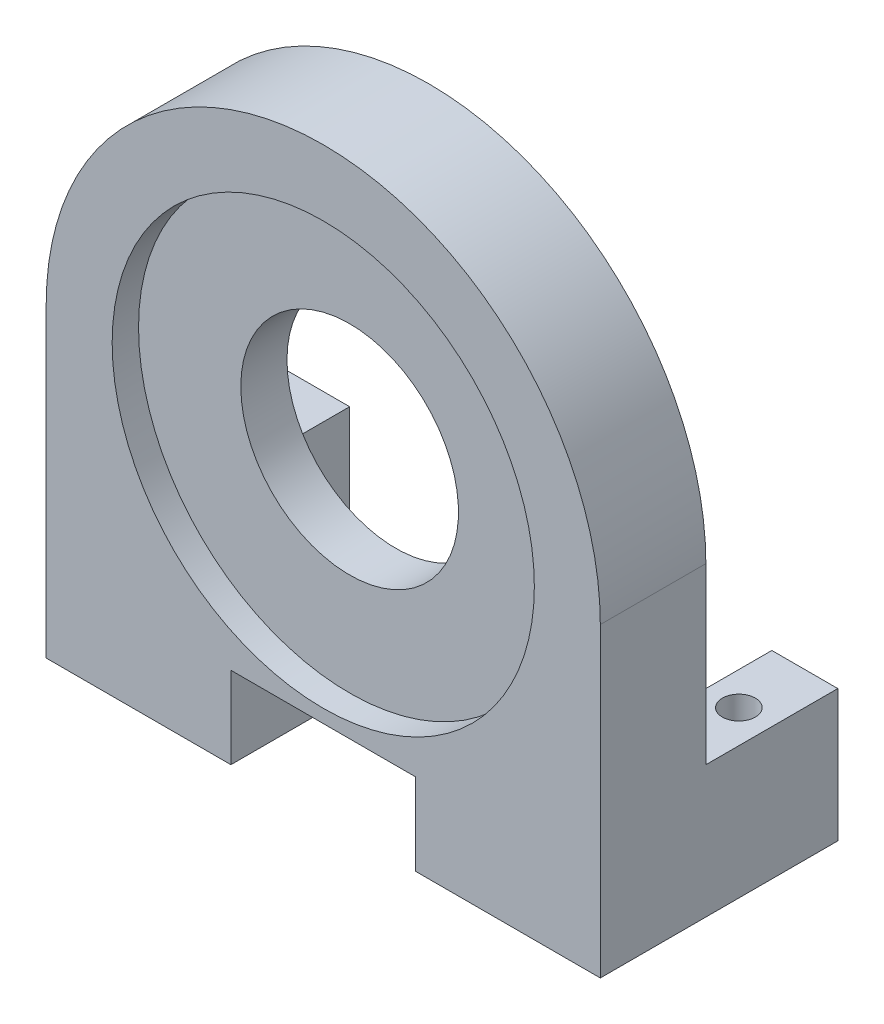
ISO-10303-21;
HEADER;
FILE_DESCRIPTION(('STEP AP214'),'2;1');
FILE_NAME('part.step','',(''),(''),'','','');
FILE_SCHEMA(('AUTOMOTIVE_DESIGN { 1 0 10303 214 1 1 1 1 }'));
ENDSEC;
DATA;
#1=APPLICATION_CONTEXT('core data for automotive mechanical design processes');
#2=APPLICATION_PROTOCOL_DEFINITION('international standard','automotive_design',2000,#1);
#3=PRODUCT_CONTEXT('',#1,'mechanical');
#4=PRODUCT('Part','Part','',(#3));
#5=PRODUCT_RELATED_PRODUCT_CATEGORY('part','',(#4));
#6=PRODUCT_DEFINITION_FORMATION('','',#4);
#7=PRODUCT_DEFINITION_CONTEXT('part definition',#1,'design');
#8=PRODUCT_DEFINITION('design','',#6,#7);
#9=PRODUCT_DEFINITION_SHAPE('','',#8);
#10=(LENGTH_UNIT() NAMED_UNIT(*) SI_UNIT(.MILLI.,.METRE.));
#11=(NAMED_UNIT(*) PLANE_ANGLE_UNIT() SI_UNIT($,.RADIAN.));
#12=(NAMED_UNIT(*) SI_UNIT($,.STERADIAN.) SOLID_ANGLE_UNIT());
#13=UNCERTAINTY_MEASURE_WITH_UNIT(LENGTH_MEASURE(1.E-05),#10,'distance_accuracy_value','');
#14=(GEOMETRIC_REPRESENTATION_CONTEXT(3) GLOBAL_UNCERTAINTY_ASSIGNED_CONTEXT((#13)) GLOBAL_UNIT_ASSIGNED_CONTEXT((#10,
#11,#12)) REPRESENTATION_CONTEXT('',''));
#15=CARTESIAN_POINT('',(0.,0.,0.));
#16=DIRECTION('',(0.,0.,1.));
#17=DIRECTION('',(1.,0.,0.));
#18=AXIS2_PLACEMENT_3D('',#15,#16,#17);
#19=CARTESIAN_POINT('',(-21.,0.,4.));
#20=DIRECTION('',(0.,1.,0.));
#21=DIRECTION('',(-1.,0.,0.));
#22=AXIS2_PLACEMENT_3D('',#19,#20,#21);
#23=PLANE('',#22);
#24=CARTESIAN_POINT('',(18.5,0.,-0.999999999999995));
#25=DIRECTION('',(0.,-1.,0.));
#26=DIRECTION('',(0.,0.,1.));
#27=AXIS2_PLACEMENT_3D('',#24,#25,#26);
#28=CIRCLE('',#27,1.25);
#29=CARTESIAN_POINT('',(18.5,0.,0.250000000000006));
#30=VERTEX_POINT('',#29);
#31=EDGE_CURVE('E167',#30,#30,#28,.T.);
#32=ORIENTED_EDGE('',*,*,#31,.F.);
#33=EDGE_LOOP('',(#32));
#34=FACE_BOUND('',#33,.T.);
#35=CARTESIAN_POINT('',(18.5,0.,-9.));
#36=DIRECTION('',(0.,-1.,0.));
#37=DIRECTION('',(0.,0.,1.));
#38=AXIS2_PLACEMENT_3D('',#35,#36,#37);
#39=CIRCLE('',#38,1.25);
#40=CARTESIAN_POINT('',(18.5,0.,-7.74999999999999));
#41=VERTEX_POINT('',#40);
#42=EDGE_CURVE('E175',#41,#41,#39,.T.);
#43=ORIENTED_EDGE('',*,*,#42,.F.);
#44=EDGE_LOOP('',(#43));
#45=FACE_BOUND('',#44,.T.);
#46=DIRECTION('',(1.,0.,0.));
#47=VECTOR('',#46,1.);
#48=CARTESIAN_POINT('',(-21.,0.,4.));
#49=LINE('',#48,#47);
#50=CARTESIAN_POINT('',(7.,0.,4.));
#51=VERTEX_POINT('',#50);
#52=CARTESIAN_POINT('',(21.,0.,4.));
#53=VERTEX_POINT('',#52);
#54=EDGE_CURVE('E256',#51,#53,#49,.T.);
#55=ORIENTED_EDGE('',*,*,#54,.F.);
#56=DIRECTION('',(0.,0.,-1.));
#57=VECTOR('',#56,1.);
#58=CARTESIAN_POINT('',(7.,0.,4.));
#59=LINE('',#58,#57);
#60=CARTESIAN_POINT('',(7.,0.,-4.));
#61=VERTEX_POINT('',#60);
#62=EDGE_CURVE('E12',#51,#61,#59,.T.);
#63=ORIENTED_EDGE('',*,*,#62,.T.);
#64=DIRECTION('',(1.,0.,0.));
#65=VECTOR('',#64,1.);
#66=CARTESIAN_POINT('',(-21.,0.,-4.));
#67=LINE('',#66,#65);
#68=CARTESIAN_POINT('',(16.,0.,-4.));
#69=VERTEX_POINT('',#68);
#70=EDGE_CURVE('E266',#61,#69,#67,.T.);
#71=ORIENTED_EDGE('',*,*,#70,.T.);
#72=DIRECTION('',(0.,0.,1.));
#73=VECTOR('',#72,1.);
#74=CARTESIAN_POINT('',(16.,0.,-14.));
#75=LINE('',#74,#73);
#76=CARTESIAN_POINT('',(16.,0.,-14.));
#77=VERTEX_POINT('',#76);
#78=EDGE_CURVE('E232',#77,#69,#75,.T.);
#79=ORIENTED_EDGE('',*,*,#78,.F.);
#80=DIRECTION('',(-1.,0.,0.));
#81=VECTOR('',#80,1.);
#82=CARTESIAN_POINT('',(21.,0.,-14.));
#83=LINE('',#82,#81);
#84=CARTESIAN_POINT('',(21.,0.,-14.));
#85=VERTEX_POINT('',#84);
#86=EDGE_CURVE('E215',#85,#77,#83,.T.);
#87=ORIENTED_EDGE('',*,*,#86,.F.);
#88=DIRECTION('',(0.,0.,-1.));
#89=VECTOR('',#88,1.);
#90=CARTESIAN_POINT('',(21.,0.,4.));
#91=LINE('',#90,#89);
#92=EDGE_CURVE('E277',#53,#85,#91,.T.);
#93=ORIENTED_EDGE('',*,*,#92,.F.);
#94=EDGE_LOOP('',(#55,#63,#71,#79,#87,#93));
#95=FACE_BOUND('',#94,.T.);
#96=ADVANCED_FACE('F35',(#34,#45,#95),#23,.F.);
#97=CARTESIAN_POINT('',(0.,23.2,-4.));
#98=DIRECTION('',(0.,0.,-1.));
#99=DIRECTION('',(-1.,0.,0.));
#100=AXIS2_PLACEMENT_3D('',#97,#98,#99);
#101=PLANE('',#100);
#102=DIRECTION('',(0.,-1.,0.));
#103=VECTOR('',#102,1.);
#104=CARTESIAN_POINT('',(7.,-6.20000000000002,-4.));
#105=LINE('',#104,#103);
#106=CARTESIAN_POINT('',(7.,6.20000000000002,-4.));
#107=VERTEX_POINT('',#106);
#108=EDGE_CURVE('E159',#107,#61,#105,.T.);
#109=ORIENTED_EDGE('',*,*,#108,.F.);
#110=DIRECTION('',(1.,0.,0.));
#111=VECTOR('',#110,1.);
#112=CARTESIAN_POINT('',(7.,6.20000000000002,-4.));
#113=LINE('',#112,#111);
#114=CARTESIAN_POINT('',(-7.,6.20000000000002,-4.));
#115=VERTEX_POINT('',#114);
#116=EDGE_CURVE('E161',#115,#107,#113,.T.);
#117=ORIENTED_EDGE('',*,*,#116,.F.);
#118=DIRECTION('',(0.,1.,0.));
#119=VECTOR('',#118,1.);
#120=CARTESIAN_POINT('',(-7.,-6.20000000000002,-4.));
#121=LINE('',#120,#119);
#122=CARTESIAN_POINT('',(-7.,0.,-4.));
#123=VERTEX_POINT('',#122);
#124=EDGE_CURVE('E140',#123,#115,#121,.T.);
#125=ORIENTED_EDGE('',*,*,#124,.F.);
#126=CARTESIAN_POINT('',(-16.,0.,-4.));
#127=VERTEX_POINT('',#126);
#128=EDGE_CURVE('E267',#127,#123,#67,.T.);
#129=ORIENTED_EDGE('',*,*,#128,.F.);
#130=DIRECTION('',(0.,-1.,0.));
#131=VECTOR('',#130,1.);
#132=CARTESIAN_POINT('',(-16.,0.,-4.));
#133=LINE('',#132,#131);
#134=CARTESIAN_POINT('',(-16.,10.,-4.));
#135=VERTEX_POINT('',#134);
#136=EDGE_CURVE('E197',#135,#127,#133,.T.);
#137=ORIENTED_EDGE('',*,*,#136,.F.);
#138=DIRECTION('',(1.,0.,0.));
#139=VECTOR('',#138,1.);
#140=CARTESIAN_POINT('',(-21.,10.,-4.));
#141=LINE('',#140,#139);
#142=CARTESIAN_POINT('',(-21.,10.,-4.));
#143=VERTEX_POINT('',#142);
#144=EDGE_CURVE('E192',#143,#135,#141,.T.);
#145=ORIENTED_EDGE('',*,*,#144,.F.);
#146=DIRECTION('',(0.,-1.,0.));
#147=VECTOR('',#146,1.);
#148=CARTESIAN_POINT('',(-21.,0.,-4.));
#149=LINE('',#148,#147);
#150=CARTESIAN_POINT('',(-21.,23.2,-4.));
#151=VERTEX_POINT('',#150);
#152=EDGE_CURVE('E251',#151,#143,#149,.T.);
#153=ORIENTED_EDGE('',*,*,#152,.F.);
#154=CARTESIAN_POINT('',(0.,23.2,-4.));
#155=DIRECTION('',(0.,0.,1.));
#156=DIRECTION('',(-1.,0.,0.));
#157=AXIS2_PLACEMENT_3D('',#154,#155,#156);
#158=CIRCLE('',#157,21.);
#159=CARTESIAN_POINT('',(21.,23.2,-4.));
#160=VERTEX_POINT('',#159);
#161=EDGE_CURVE('E257',#160,#151,#158,.T.);
#162=ORIENTED_EDGE('',*,*,#161,.F.);
#163=DIRECTION('',(0.,1.,0.));
#164=VECTOR('',#163,1.);
#165=CARTESIAN_POINT('',(21.,23.2,-4.));
#166=LINE('',#165,#164);
#167=CARTESIAN_POINT('',(21.,10.,-4.));
#168=VERTEX_POINT('',#167);
#169=EDGE_CURVE('E269',#168,#160,#166,.T.);
#170=ORIENTED_EDGE('',*,*,#169,.F.);
#171=DIRECTION('',(1.,0.,0.));
#172=VECTOR('',#171,1.);
#173=CARTESIAN_POINT('',(21.,10.,-4.));
#174=LINE('',#173,#172);
#175=CARTESIAN_POINT('',(16.,10.,-4.));
#176=VERTEX_POINT('',#175);
#177=EDGE_CURVE('E216',#176,#168,#174,.T.);
#178=ORIENTED_EDGE('',*,*,#177,.F.);
#179=DIRECTION('',(0.,1.,0.));
#180=VECTOR('',#179,1.);
#181=CARTESIAN_POINT('',(16.,0.,-4.));
#182=LINE('',#181,#180);
#183=EDGE_CURVE('E211',#69,#176,#182,.T.);
#184=ORIENTED_EDGE('',*,*,#183,.F.);
#185=ORIENTED_EDGE('',*,*,#70,.F.);
#186=EDGE_LOOP('',(#109,#117,#125,#129,#137,#145,#153,#162,#170,#178,#184,#185));
#187=FACE_BOUND('',#186,.T.);
#188=CARTESIAN_POINT('',(0.,23.2,-4.));
#189=DIRECTION('',(0.,0.,1.));
#190=DIRECTION('',(1.,0.,0.));
#191=AXIS2_PLACEMENT_3D('',#188,#189,#190);
#192=CIRCLE('',#191,16.);
#193=CARTESIAN_POINT('',(16.,23.2,-4.));
#194=VERTEX_POINT('',#193);
#195=EDGE_CURVE('E247',#194,#194,#192,.T.);
#196=ORIENTED_EDGE('',*,*,#195,.T.);
#197=EDGE_LOOP('',(#196));
#198=FACE_BOUND('',#197,.T.);
#199=ADVANCED_FACE('F284',(#187,#198),#101,.T.);
#200=CARTESIAN_POINT('',(0.,23.2,4.));
#201=DIRECTION('',(0.,0.,-1.));
#202=DIRECTION('',(-1.,0.,0.));
#203=AXIS2_PLACEMENT_3D('',#200,#201,#202);
#204=CYLINDRICAL_SURFACE('',#203,16.);
#205=CARTESIAN_POINT('',(0.,23.2,4.));
#206=DIRECTION('',(0.,0.,1.));
#207=DIRECTION('',(1.,0.,0.));
#208=AXIS2_PLACEMENT_3D('',#205,#206,#207);
#209=CIRCLE('',#208,16.);
#210=CARTESIAN_POINT('',(16.,23.2,4.));
#211=VERTEX_POINT('',#210);
#212=EDGE_CURVE('E248',#211,#211,#209,.T.);
#213=ORIENTED_EDGE('',*,*,#212,.T.);
#214=EDGE_LOOP('',(#213));
#215=FACE_BOUND('',#214,.T.);
#216=CARTESIAN_POINT('',(0.,23.2,2.));
#217=DIRECTION('',(0.,0.,-1.));
#218=DIRECTION('',(-1.,0.,0.));
#219=AXIS2_PLACEMENT_3D('',#216,#217,#218);
#220=CIRCLE('',#219,16.);
#221=CARTESIAN_POINT('',(-16.,23.2,2.));
#222=VERTEX_POINT('',#221);
#223=EDGE_CURVE('E241',#222,#222,#220,.T.);
#224=ORIENTED_EDGE('',*,*,#223,.T.);
#225=EDGE_LOOP('',(#224));
#226=FACE_BOUND('',#225,.T.);
#227=ADVANCED_FACE('F339',(#215,#226),#204,.F.);
#228=ORIENTED_EDGE('',*,*,#195,.F.);
#229=EDGE_LOOP('',(#228));
#230=FACE_BOUND('',#229,.T.);
#231=CARTESIAN_POINT('',(0.,23.2,-1.5));
#232=DIRECTION('',(0.,0.,1.));
#233=DIRECTION('',(1.,0.,0.));
#234=AXIS2_PLACEMENT_3D('',#231,#232,#233);
#235=CIRCLE('',#234,16.);
#236=CARTESIAN_POINT('',(16.,23.2,-1.5));
#237=VERTEX_POINT('',#236);
#238=EDGE_CURVE('E238',#237,#237,#235,.T.);
#239=ORIENTED_EDGE('',*,*,#238,.T.);
#240=EDGE_LOOP('',(#239));
#241=FACE_BOUND('',#240,.T.);
#242=ADVANCED_FACE('F432',(#230,#241),#204,.F.);
#243=CARTESIAN_POINT('',(0.,23.2,4.));
#244=DIRECTION('',(0.,0.,-1.));
#245=DIRECTION('',(-1.,0.,0.));
#246=AXIS2_PLACEMENT_3D('',#243,#244,#245);
#247=PLANE('',#246);
#248=DIRECTION('',(1.,0.,0.));
#249=VECTOR('',#248,1.);
#250=CARTESIAN_POINT('',(7.,6.20000000000002,4.));
#251=LINE('',#250,#249);
#252=CARTESIAN_POINT('',(-7.,6.20000000000002,4.));
#253=VERTEX_POINT('',#252);
#254=CARTESIAN_POINT('',(7.,6.20000000000002,4.));
#255=VERTEX_POINT('',#254);
#256=EDGE_CURVE('E148',#253,#255,#251,.T.);
#257=ORIENTED_EDGE('',*,*,#256,.T.);
#258=DIRECTION('',(0.,-1.,0.));
#259=VECTOR('',#258,1.);
#260=CARTESIAN_POINT('',(7.,-6.20000000000002,4.));
#261=LINE('',#260,#259);
#262=EDGE_CURVE('E145',#255,#51,#261,.T.);
#263=ORIENTED_EDGE('',*,*,#262,.T.);
#264=ORIENTED_EDGE('',*,*,#54,.T.);
#265=DIRECTION('',(0.,1.,0.));
#266=VECTOR('',#265,1.);
#267=CARTESIAN_POINT('',(21.,23.2,4.));
#268=LINE('',#267,#266);
#269=CARTESIAN_POINT('',(21.,23.2,4.));
#270=VERTEX_POINT('',#269);
#271=EDGE_CURVE('E259',#53,#270,#268,.T.);
#272=ORIENTED_EDGE('',*,*,#271,.T.);
#273=CARTESIAN_POINT('',(0.,23.2,4.));
#274=DIRECTION('',(0.,0.,1.));
#275=DIRECTION('',(-1.,0.,0.));
#276=AXIS2_PLACEMENT_3D('',#273,#274,#275);
#277=CIRCLE('',#276,21.);
#278=CARTESIAN_POINT('',(-21.,23.2,4.));
#279=VERTEX_POINT('',#278);
#280=EDGE_CURVE('E261',#270,#279,#277,.T.);
#281=ORIENTED_EDGE('',*,*,#280,.T.);
#282=DIRECTION('',(0.,-1.,0.));
#283=VECTOR('',#282,1.);
#284=CARTESIAN_POINT('',(-21.,0.,4.));
#285=LINE('',#284,#283);
#286=CARTESIAN_POINT('',(-21.,0.,4.));
#287=VERTEX_POINT('',#286);
#288=EDGE_CURVE('E254',#279,#287,#285,.T.);
#289=ORIENTED_EDGE('',*,*,#288,.T.);
#290=CARTESIAN_POINT('',(-7.,0.,4.));
#291=VERTEX_POINT('',#290);
#292=EDGE_CURVE('E158',#287,#291,#49,.T.);
#293=ORIENTED_EDGE('',*,*,#292,.T.);
#294=DIRECTION('',(0.,1.,0.));
#295=VECTOR('',#294,1.);
#296=CARTESIAN_POINT('',(-7.,-6.20000000000002,4.));
#297=LINE('',#296,#295);
#298=EDGE_CURVE('E50',#291,#253,#297,.T.);
#299=ORIENTED_EDGE('',*,*,#298,.T.);
#300=EDGE_LOOP('',(#257,#263,#264,#272,#281,#289,#293,#299));
#301=FACE_BOUND('',#300,.T.);
#302=ORIENTED_EDGE('',*,*,#212,.F.);
#303=EDGE_LOOP('',(#302));
#304=FACE_BOUND('',#303,.T.);
#305=ADVANCED_FACE('F155',(#301,#304),#247,.F.);
#306=CARTESIAN_POINT('',(-21.,0.,4.));
#307=DIRECTION('',(1.,0.,0.));
#308=DIRECTION('',(0.,0.,-1.));
#309=AXIS2_PLACEMENT_3D('',#306,#307,#308);
#310=PLANE('',#309);
#311=ORIENTED_EDGE('',*,*,#152,.T.);
#312=DIRECTION('',(0.,0.,1.));
#313=VECTOR('',#312,1.);
#314=CARTESIAN_POINT('',(-21.,10.,-14.));
#315=LINE('',#314,#313);
#316=CARTESIAN_POINT('',(-21.,10.,-14.));
#317=VERTEX_POINT('',#316);
#318=EDGE_CURVE('E209',#317,#143,#315,.T.);
#319=ORIENTED_EDGE('',*,*,#318,.F.);
#320=DIRECTION('',(0.,1.,0.));
#321=VECTOR('',#320,1.);
#322=CARTESIAN_POINT('',(-21.,0.,-14.));
#323=LINE('',#322,#321);
#324=CARTESIAN_POINT('',(-21.,0.,-14.));
#325=VERTEX_POINT('',#324);
#326=EDGE_CURVE('E196',#325,#317,#323,.T.);
#327=ORIENTED_EDGE('',*,*,#326,.F.);
#328=DIRECTION('',(0.,0.,-1.));
#329=VECTOR('',#328,1.);
#330=CARTESIAN_POINT('',(-21.,0.,4.));
#331=LINE('',#330,#329);
#332=EDGE_CURVE('E279',#287,#325,#331,.T.);
#333=ORIENTED_EDGE('',*,*,#332,.F.);
#334=ORIENTED_EDGE('',*,*,#288,.F.);
#335=DIRECTION('',(0.,0.,-1.));
#336=VECTOR('',#335,1.);
#337=CARTESIAN_POINT('',(-21.,23.2,4.));
#338=LINE('',#337,#336);
#339=EDGE_CURVE('E263',#279,#151,#338,.T.);
#340=ORIENTED_EDGE('',*,*,#339,.T.);
#341=EDGE_LOOP('',(#311,#319,#327,#333,#334,#340));
#342=FACE_BOUND('',#341,.T.);
#343=ADVANCED_FACE('F37',(#342),#310,.F.);
#344=CARTESIAN_POINT('',(-18.5,0.,-1.));
#345=DIRECTION('',(0.,-1.,0.));
#346=DIRECTION('',(0.,0.,-1.));
#347=AXIS2_PLACEMENT_3D('',#344,#345,#346);
#348=CIRCLE('',#347,1.25);
#349=CARTESIAN_POINT('',(-18.5,0.,-2.25));
#350=VERTEX_POINT('',#349);
#351=EDGE_CURVE('E174',#350,#350,#348,.T.);
#352=ORIENTED_EDGE('',*,*,#351,.F.);
#353=EDGE_LOOP('',(#352));
#354=FACE_BOUND('',#353,.T.);
#355=CARTESIAN_POINT('',(-18.5,0.,-9.));
#356=DIRECTION('',(0.,-1.,0.));
#357=DIRECTION('',(0.,0.,-1.));
#358=AXIS2_PLACEMENT_3D('',#355,#356,#357);
#359=CIRCLE('',#358,1.25);
#360=CARTESIAN_POINT('',(-18.5,0.,-10.25));
#361=VERTEX_POINT('',#360);
#362=EDGE_CURVE('E182',#361,#361,#359,.T.);
#363=ORIENTED_EDGE('',*,*,#362,.F.);
#364=EDGE_LOOP('',(#363));
#365=FACE_BOUND('',#364,.T.);
#366=ORIENTED_EDGE('',*,*,#128,.T.);
#367=DIRECTION('',(0.,0.,1.));
#368=VECTOR('',#367,1.);
#369=CARTESIAN_POINT('',(-7.,0.,4.));
#370=LINE('',#369,#368);
#371=EDGE_CURVE('E43',#123,#291,#370,.T.);
#372=ORIENTED_EDGE('',*,*,#371,.T.);
#373=ORIENTED_EDGE('',*,*,#292,.F.);
#374=ORIENTED_EDGE('',*,*,#332,.T.);
#375=DIRECTION('',(-1.,0.,0.));
#376=VECTOR('',#375,1.);
#377=CARTESIAN_POINT('',(-21.,0.,-14.));
#378=LINE('',#377,#376);
#379=CARTESIAN_POINT('',(-16.,0.,-14.));
#380=VERTEX_POINT('',#379);
#381=EDGE_CURVE('E193',#380,#325,#378,.T.);
#382=ORIENTED_EDGE('',*,*,#381,.F.);
#383=DIRECTION('',(0.,0.,1.));
#384=VECTOR('',#383,1.);
#385=CARTESIAN_POINT('',(-16.,0.,-14.));
#386=LINE('',#385,#384);
#387=EDGE_CURVE('E58',#380,#127,#386,.T.);
#388=ORIENTED_EDGE('',*,*,#387,.T.);
#389=EDGE_LOOP('',(#366,#372,#373,#374,#382,#388));
#390=FACE_BOUND('',#389,.T.);
#391=ADVANCED_FACE('F280',(#354,#365,#390),#23,.F.);
#392=CARTESIAN_POINT('',(21.,23.2,4.));
#393=DIRECTION('',(-1.,0.,0.));
#394=DIRECTION('',(0.,0.,1.));
#395=AXIS2_PLACEMENT_3D('',#392,#393,#394);
#396=PLANE('',#395);
#397=ORIENTED_EDGE('',*,*,#92,.T.);
#398=DIRECTION('',(0.,-1.,0.));
#399=VECTOR('',#398,1.);
#400=CARTESIAN_POINT('',(21.,0.,-14.));
#401=LINE('',#400,#399);
#402=CARTESIAN_POINT('',(21.,10.,-14.));
#403=VERTEX_POINT('',#402);
#404=EDGE_CURVE('E212',#403,#85,#401,.T.);
#405=ORIENTED_EDGE('',*,*,#404,.F.);
#406=DIRECTION('',(0.,0.,1.));
#407=VECTOR('',#406,1.);
#408=CARTESIAN_POINT('',(21.,10.,-14.));
#409=LINE('',#408,#407);
#410=EDGE_CURVE('E222',#403,#168,#409,.T.);
#411=ORIENTED_EDGE('',*,*,#410,.T.);
#412=ORIENTED_EDGE('',*,*,#169,.T.);
#413=DIRECTION('',(0.,0.,-1.));
#414=VECTOR('',#413,1.);
#415=CARTESIAN_POINT('',(21.,23.2,4.));
#416=LINE('',#415,#414);
#417=EDGE_CURVE('E274',#270,#160,#416,.T.);
#418=ORIENTED_EDGE('',*,*,#417,.F.);
#419=ORIENTED_EDGE('',*,*,#271,.F.);
#420=EDGE_LOOP('',(#397,#405,#411,#412,#418,#419));
#421=FACE_BOUND('',#420,.T.);
#422=ADVANCED_FACE('F301',(#421),#396,.F.);
#423=CARTESIAN_POINT('',(0.,23.2,4.));
#424=DIRECTION('',(0.,0.,-1.));
#425=DIRECTION('',(-1.,0.,0.));
#426=AXIS2_PLACEMENT_3D('',#423,#424,#425);
#427=CYLINDRICAL_SURFACE('',#426,21.);
#428=ORIENTED_EDGE('',*,*,#161,.T.);
#429=ORIENTED_EDGE('',*,*,#339,.F.);
#430=ORIENTED_EDGE('',*,*,#280,.F.);
#431=ORIENTED_EDGE('',*,*,#417,.T.);
#432=EDGE_LOOP('',(#428,#429,#430,#431));
#433=FACE_BOUND('',#432,.T.);
#434=ADVANCED_FACE('F304',(#433),#427,.T.);
#435=CARTESIAN_POINT('',(0.,23.2,49.254833995939));
#436=DIRECTION('',(0.,0.,-1.));
#437=DIRECTION('',(-1.,0.,0.));
#438=AXIS2_PLACEMENT_3D('',#435,#436,#437);
#439=CYLINDRICAL_SURFACE('',#438,8.25);
#440=CARTESIAN_POINT('',(0.,23.2,2.));
#441=DIRECTION('',(0.,0.,-1.));
#442=DIRECTION('',(-1.,0.,0.));
#443=AXIS2_PLACEMENT_3D('',#440,#441,#442);
#444=CIRCLE('',#443,8.25);
#445=CARTESIAN_POINT('',(-8.25000000000002,23.2,2.));
#446=VERTEX_POINT('',#445);
#447=EDGE_CURVE('E244',#446,#446,#444,.T.);
#448=ORIENTED_EDGE('',*,*,#447,.F.);
#449=EDGE_LOOP('',(#448));
#450=FACE_BOUND('',#449,.T.);
#451=CARTESIAN_POINT('',(0.,23.2,-1.5));
#452=DIRECTION('',(0.,0.,1.));
#453=DIRECTION('',(1.,0.,0.));
#454=AXIS2_PLACEMENT_3D('',#451,#452,#453);
#455=CIRCLE('',#454,8.25);
#456=CARTESIAN_POINT('',(8.24999999999998,23.2,-1.5));
#457=VERTEX_POINT('',#456);
#458=EDGE_CURVE('E235',#457,#457,#455,.T.);
#459=ORIENTED_EDGE('',*,*,#458,.F.);
#460=EDGE_LOOP('',(#459));
#461=FACE_BOUND('',#460,.T.);
#462=ADVANCED_FACE('F541',(#450,#461),#439,.F.);
#463=CARTESIAN_POINT('',(0.,23.2,2.));
#464=DIRECTION('',(0.,0.,-1.));
#465=DIRECTION('',(-1.,0.,0.));
#466=AXIS2_PLACEMENT_3D('',#463,#464,#465);
#467=PLANE('',#466);
#468=ORIENTED_EDGE('',*,*,#447,.T.);
#469=EDGE_LOOP('',(#468));
#470=FACE_BOUND('',#469,.T.);
#471=ORIENTED_EDGE('',*,*,#223,.F.);
#472=EDGE_LOOP('',(#471));
#473=FACE_BOUND('',#472,.T.);
#474=ADVANCED_FACE('F534',(#470,#473),#467,.F.);
#475=CARTESIAN_POINT('',(0.,23.2,-1.5));
#476=DIRECTION('',(0.,0.,1.));
#477=DIRECTION('',(1.,0.,0.));
#478=AXIS2_PLACEMENT_3D('',#475,#476,#477);
#479=PLANE('',#478);
#480=ORIENTED_EDGE('',*,*,#458,.T.);
#481=EDGE_LOOP('',(#480));
#482=FACE_BOUND('',#481,.T.);
#483=ORIENTED_EDGE('',*,*,#238,.F.);
#484=EDGE_LOOP('',(#483));
#485=FACE_BOUND('',#484,.T.);
#486=ADVANCED_FACE('F464',(#482,#485),#479,.F.);
#487=CARTESIAN_POINT('',(16.,0.,-14.));
#488=DIRECTION('',(1.,0.,0.));
#489=DIRECTION('',(0.,0.,-1.));
#490=AXIS2_PLACEMENT_3D('',#487,#488,#489);
#491=PLANE('',#490);
#492=ORIENTED_EDGE('',*,*,#183,.T.);
#493=DIRECTION('',(0.,0.,1.));
#494=VECTOR('',#493,1.);
#495=CARTESIAN_POINT('',(16.,10.,-14.));
#496=LINE('',#495,#494);
#497=CARTESIAN_POINT('',(16.,10.,-14.));
#498=VERTEX_POINT('',#497);
#499=EDGE_CURVE('E229',#498,#176,#496,.T.);
#500=ORIENTED_EDGE('',*,*,#499,.F.);
#501=DIRECTION('',(0.,1.,0.));
#502=VECTOR('',#501,1.);
#503=CARTESIAN_POINT('',(16.,0.,-14.));
#504=LINE('',#503,#502);
#505=EDGE_CURVE('E218',#77,#498,#504,.T.);
#506=ORIENTED_EDGE('',*,*,#505,.F.);
#507=ORIENTED_EDGE('',*,*,#78,.T.);
#508=EDGE_LOOP('',(#492,#500,#506,#507));
#509=FACE_BOUND('',#508,.T.);
#510=ADVANCED_FACE('F459',(#509),#491,.F.);
#511=CARTESIAN_POINT('',(21.,10.,-14.));
#512=DIRECTION('',(0.,-1.,0.));
#513=DIRECTION('',(0.,0.,-1.));
#514=AXIS2_PLACEMENT_3D('',#511,#512,#513);
#515=PLANE('',#514);
#516=CARTESIAN_POINT('',(18.5,9.99999999999999,-9.));
#517=DIRECTION('',(0.,-1.,0.));
#518=DIRECTION('',(1.,0.,0.));
#519=AXIS2_PLACEMENT_3D('',#516,#517,#518);
#520=CIRCLE('',#519,1.25);
#521=CARTESIAN_POINT('',(19.75,9.99999999999999,-9.));
#522=VERTEX_POINT('',#521);
#523=EDGE_CURVE('E178',#522,#522,#520,.F.);
#524=ORIENTED_EDGE('',*,*,#523,.F.);
#525=EDGE_LOOP('',(#524));
#526=FACE_BOUND('',#525,.T.);
#527=ORIENTED_EDGE('',*,*,#177,.T.);
#528=ORIENTED_EDGE('',*,*,#410,.F.);
#529=DIRECTION('',(1.,0.,0.));
#530=VECTOR('',#529,1.);
#531=CARTESIAN_POINT('',(21.,10.,-14.));
#532=LINE('',#531,#530);
#533=EDGE_CURVE('E220',#498,#403,#532,.T.);
#534=ORIENTED_EDGE('',*,*,#533,.F.);
#535=ORIENTED_EDGE('',*,*,#499,.T.);
#536=EDGE_LOOP('',(#527,#528,#534,#535));
#537=FACE_BOUND('',#536,.T.);
#538=ADVANCED_FACE('F330',(#526,#537),#515,.F.);
#539=CARTESIAN_POINT('',(0.,0.,-14.));
#540=DIRECTION('',(0.,0.,1.));
#541=DIRECTION('',(1.,0.,0.));
#542=AXIS2_PLACEMENT_3D('',#539,#540,#541);
#543=PLANE('',#542);
#544=ORIENTED_EDGE('',*,*,#404,.T.);
#545=ORIENTED_EDGE('',*,*,#86,.T.);
#546=ORIENTED_EDGE('',*,*,#505,.T.);
#547=ORIENTED_EDGE('',*,*,#533,.T.);
#548=EDGE_LOOP('',(#544,#545,#546,#547));
#549=FACE_BOUND('',#548,.T.);
#550=ADVANCED_FACE('F322',(#549),#543,.F.);
#551=CARTESIAN_POINT('',(-21.,10.,-14.));
#552=DIRECTION('',(0.,-1.,0.));
#553=DIRECTION('',(1.,0.,0.));
#554=AXIS2_PLACEMENT_3D('',#551,#552,#553);
#555=PLANE('',#554);
#556=CARTESIAN_POINT('',(-18.5,10.,-9.));
#557=DIRECTION('',(0.,-1.,0.));
#558=DIRECTION('',(1.,0.,0.));
#559=AXIS2_PLACEMENT_3D('',#556,#557,#558);
#560=CIRCLE('',#559,1.25);
#561=CARTESIAN_POINT('',(-17.25,10.,-9.));
#562=VERTEX_POINT('',#561);
#563=EDGE_CURVE('E189',#562,#562,#560,.F.);
#564=ORIENTED_EDGE('',*,*,#563,.F.);
#565=EDGE_LOOP('',(#564));
#566=FACE_BOUND('',#565,.T.);
#567=ORIENTED_EDGE('',*,*,#144,.T.);
#568=DIRECTION('',(0.,0.,1.));
#569=VECTOR('',#568,1.);
#570=CARTESIAN_POINT('',(-16.,10.,-14.));
#571=LINE('',#570,#569);
#572=CARTESIAN_POINT('',(-16.,10.,-14.));
#573=VERTEX_POINT('',#572);
#574=EDGE_CURVE('E206',#573,#135,#571,.T.);
#575=ORIENTED_EDGE('',*,*,#574,.F.);
#576=DIRECTION('',(1.,0.,0.));
#577=VECTOR('',#576,1.);
#578=CARTESIAN_POINT('',(-21.,10.,-14.));
#579=LINE('',#578,#577);
#580=EDGE_CURVE('E199',#317,#573,#579,.T.);
#581=ORIENTED_EDGE('',*,*,#580,.F.);
#582=ORIENTED_EDGE('',*,*,#318,.T.);
#583=EDGE_LOOP('',(#567,#575,#581,#582));
#584=FACE_BOUND('',#583,.T.);
#585=ADVANCED_FACE('F320',(#566,#584),#555,.F.);
#586=CARTESIAN_POINT('',(-16.,0.,-14.));
#587=DIRECTION('',(-1.,0.,0.));
#588=DIRECTION('',(0.,-1.,0.));
#589=AXIS2_PLACEMENT_3D('',#586,#587,#588);
#590=PLANE('',#589);
#591=ORIENTED_EDGE('',*,*,#136,.T.);
#592=ORIENTED_EDGE('',*,*,#387,.F.);
#593=DIRECTION('',(0.,-1.,0.));
#594=VECTOR('',#593,1.);
#595=CARTESIAN_POINT('',(-16.,0.,-14.));
#596=LINE('',#595,#594);
#597=EDGE_CURVE('E201',#573,#380,#596,.T.);
#598=ORIENTED_EDGE('',*,*,#597,.F.);
#599=ORIENTED_EDGE('',*,*,#574,.T.);
#600=EDGE_LOOP('',(#591,#592,#598,#599));
#601=FACE_BOUND('',#600,.T.);
#602=ADVANCED_FACE('F317',(#601),#590,.F.);
#603=CARTESIAN_POINT('',(0.,0.,-14.));
#604=DIRECTION('',(0.,0.,1.));
#605=DIRECTION('',(1.,0.,0.));
#606=AXIS2_PLACEMENT_3D('',#603,#604,#605);
#607=PLANE('',#606);
#608=ORIENTED_EDGE('',*,*,#381,.T.);
#609=ORIENTED_EDGE('',*,*,#326,.T.);
#610=ORIENTED_EDGE('',*,*,#580,.T.);
#611=ORIENTED_EDGE('',*,*,#597,.T.);
#612=EDGE_LOOP('',(#608,#609,#610,#611));
#613=FACE_BOUND('',#612,.T.);
#614=ADVANCED_FACE('F312',(#613),#607,.F.);
#615=CARTESIAN_POINT('',(-18.5,13.5355339059327,-9.));
#616=DIRECTION('',(0.,-1.,0.));
#617=DIRECTION('',(0.,0.,-1.));
#618=AXIS2_PLACEMENT_3D('',#615,#616,#617);
#619=CYLINDRICAL_SURFACE('',#618,1.25);
#620=ORIENTED_EDGE('',*,*,#563,.T.);
#621=EDGE_LOOP('',(#620));
#622=FACE_BOUND('',#621,.T.);
#623=ORIENTED_EDGE('',*,*,#362,.T.);
#624=EDGE_LOOP('',(#623));
#625=FACE_BOUND('',#624,.T.);
#626=ADVANCED_FACE('F354',(#622,#625),#619,.F.);
#627=CARTESIAN_POINT('',(18.5,13.5355339059327,-9.));
#628=DIRECTION('',(0.,-1.,0.));
#629=DIRECTION('',(0.,0.,-1.));
#630=AXIS2_PLACEMENT_3D('',#627,#628,#629);
#631=CYLINDRICAL_SURFACE('',#630,1.25);
#632=ORIENTED_EDGE('',*,*,#523,.T.);
#633=EDGE_LOOP('',(#632));
#634=FACE_BOUND('',#633,.T.);
#635=ORIENTED_EDGE('',*,*,#42,.T.);
#636=EDGE_LOOP('',(#635));
#637=FACE_BOUND('',#636,.T.);
#638=ADVANCED_FACE('F356',(#634,#637),#631,.F.);
#639=CARTESIAN_POINT('',(18.5,13.5355339059327,-0.999999999999995));
#640=DIRECTION('',(0.,-1.,0.));
#641=DIRECTION('',(0.,0.,-1.));
#642=AXIS2_PLACEMENT_3D('',#639,#640,#641);
#643=CYLINDRICAL_SURFACE('',#642,1.25);
#644=CARTESIAN_POINT('',(18.5,9.99999999999999,-0.999999999999995));
#645=DIRECTION('',(0.,-1.,0.));
#646=DIRECTION('',(1.,0.,0.));
#647=AXIS2_PLACEMENT_3D('',#644,#645,#646);
#648=CIRCLE('',#647,1.25);
#649=CARTESIAN_POINT('',(19.75,9.99999999999999,-0.999999999999995));
#650=VERTEX_POINT('',#649);
#651=EDGE_CURVE('E171',#650,#650,#648,.F.);
#652=ORIENTED_EDGE('',*,*,#651,.T.);
#653=EDGE_LOOP('',(#652));
#654=FACE_BOUND('',#653,.T.);
#655=ORIENTED_EDGE('',*,*,#31,.T.);
#656=EDGE_LOOP('',(#655));
#657=FACE_BOUND('',#656,.T.);
#658=ADVANCED_FACE('F363',(#654,#657),#643,.F.);
#659=CARTESIAN_POINT('',(-21.,10.,-14.));
#660=DIRECTION('',(0.,-1.,0.));
#661=DIRECTION('',(1.,0.,0.));
#662=AXIS2_PLACEMENT_3D('',#659,#660,#661);
#663=PLANE('',#662);
#664=ORIENTED_EDGE('',*,*,#651,.F.);
#665=EDGE_LOOP('',(#664));
#666=FACE_BOUND('',#665,.T.);
#667=ADVANCED_FACE('F372',(#666),#663,.T.);
#668=CARTESIAN_POINT('',(-18.5,13.5355339059327,-1.));
#669=DIRECTION('',(0.,-1.,0.));
#670=DIRECTION('',(0.,0.,-1.));
#671=AXIS2_PLACEMENT_3D('',#668,#669,#670);
#672=CYLINDRICAL_SURFACE('',#671,1.25);
#673=CARTESIAN_POINT('',(-18.5,10.,-1.));
#674=DIRECTION('',(0.,-1.,0.));
#675=DIRECTION('',(1.,0.,0.));
#676=AXIS2_PLACEMENT_3D('',#673,#674,#675);
#677=CIRCLE('',#676,1.25);
#678=CARTESIAN_POINT('',(-17.25,10.,-1.));
#679=VERTEX_POINT('',#678);
#680=EDGE_CURVE('E179',#679,#679,#677,.F.);
#681=ORIENTED_EDGE('',*,*,#680,.T.);
#682=EDGE_LOOP('',(#681));
#683=FACE_BOUND('',#682,.T.);
#684=ORIENTED_EDGE('',*,*,#351,.T.);
#685=EDGE_LOOP('',(#684));
#686=FACE_BOUND('',#685,.T.);
#687=ADVANCED_FACE('F368',(#683,#686),#672,.F.);
#688=CARTESIAN_POINT('',(-21.,10.,-14.));
#689=DIRECTION('',(0.,-1.,0.));
#690=DIRECTION('',(1.,0.,0.));
#691=AXIS2_PLACEMENT_3D('',#688,#689,#690);
#692=PLANE('',#691);
#693=ORIENTED_EDGE('',*,*,#680,.F.);
#694=EDGE_LOOP('',(#693));
#695=FACE_BOUND('',#694,.T.);
#696=ADVANCED_FACE('F371',(#695),#692,.T.);
#697=CARTESIAN_POINT('',(7.,-6.20000000000002,4.));
#698=DIRECTION('',(1.,0.,0.));
#699=DIRECTION('',(0.,0.,-1.));
#700=AXIS2_PLACEMENT_3D('',#697,#698,#699);
#701=PLANE('',#700);
#702=ORIENTED_EDGE('',*,*,#262,.F.);
#703=DIRECTION('',(0.,0.,-1.));
#704=VECTOR('',#703,1.);
#705=CARTESIAN_POINT('',(7.,6.20000000000002,4.));
#706=LINE('',#705,#704);
#707=EDGE_CURVE('E144',#255,#107,#706,.T.);
#708=ORIENTED_EDGE('',*,*,#707,.T.);
#709=ORIENTED_EDGE('',*,*,#108,.T.);
#710=ORIENTED_EDGE('',*,*,#62,.F.);
#711=EDGE_LOOP('',(#702,#708,#709,#710));
#712=FACE_BOUND('',#711,.T.);
#713=ADVANCED_FACE('F290',(#712),#701,.F.);
#714=CARTESIAN_POINT('',(-7.,-6.20000000000002,4.));
#715=DIRECTION('',(-1.,0.,0.));
#716=DIRECTION('',(0.,0.,1.));
#717=AXIS2_PLACEMENT_3D('',#714,#715,#716);
#718=PLANE('',#717);
#719=ORIENTED_EDGE('',*,*,#124,.T.);
#720=DIRECTION('',(0.,0.,-1.));
#721=VECTOR('',#720,1.);
#722=CARTESIAN_POINT('',(-7.,6.20000000000002,4.));
#723=LINE('',#722,#721);
#724=EDGE_CURVE('E136',#253,#115,#723,.T.);
#725=ORIENTED_EDGE('',*,*,#724,.F.);
#726=ORIENTED_EDGE('',*,*,#298,.F.);
#727=ORIENTED_EDGE('',*,*,#371,.F.);
#728=EDGE_LOOP('',(#719,#725,#726,#727));
#729=FACE_BOUND('',#728,.T.);
#730=ADVANCED_FACE('F138',(#729),#718,.F.);
#731=CARTESIAN_POINT('',(7.,6.20000000000002,4.));
#732=DIRECTION('',(0.,1.,0.));
#733=DIRECTION('',(0.,0.,1.));
#734=AXIS2_PLACEMENT_3D('',#731,#732,#733);
#735=PLANE('',#734);
#736=ORIENTED_EDGE('',*,*,#116,.T.);
#737=ORIENTED_EDGE('',*,*,#707,.F.);
#738=ORIENTED_EDGE('',*,*,#256,.F.);
#739=ORIENTED_EDGE('',*,*,#724,.T.);
#740=EDGE_LOOP('',(#736,#737,#738,#739));
#741=FACE_BOUND('',#740,.T.);
#742=ADVANCED_FACE('F149',(#741),#735,.F.);
#743=CLOSED_SHELL('',(#96,#199,#227,#242,#305,#343,#391,#422,#434,#462,#474,#486,#510,#538,#550,
#585,#602,#614,#626,#638,#658,#667,#687,#696,#713,#730,#742));
#744=MANIFOLD_SOLID_BREP('B2',#743);
#745=ADVANCED_BREP_SHAPE_REPRESENTATION('',(#18,#744),#14);
#746=SHAPE_DEFINITION_REPRESENTATION(#9,#745);
ENDSEC;
END-ISO-10303-21;
